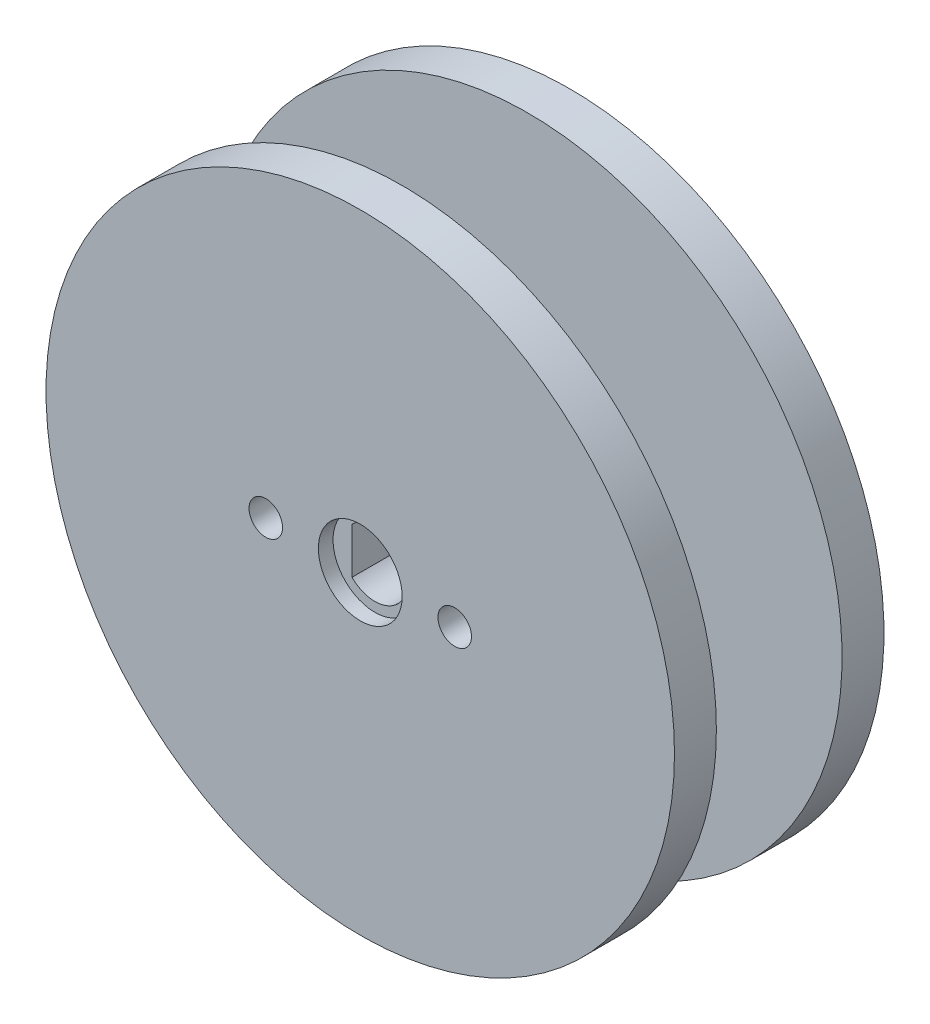
ISO-10303-21;
HEADER;
FILE_DESCRIPTION(('STEP AP214'),'2;1');
FILE_NAME('part.step','',(''),(''),'','','');
FILE_SCHEMA(('AUTOMOTIVE_DESIGN { 1 0 10303 214 1 1 1 1 }'));
ENDSEC;
DATA;
#1=APPLICATION_CONTEXT('core data for automotive mechanical design processes');
#2=APPLICATION_PROTOCOL_DEFINITION('international standard','automotive_design',2000,#1);
#3=PRODUCT_CONTEXT('',#1,'mechanical');
#4=PRODUCT('Part','Part','',(#3));
#5=PRODUCT_RELATED_PRODUCT_CATEGORY('part','',(#4));
#6=PRODUCT_DEFINITION_FORMATION('','',#4);
#7=PRODUCT_DEFINITION_CONTEXT('part definition',#1,'design');
#8=PRODUCT_DEFINITION('design','',#6,#7);
#9=PRODUCT_DEFINITION_SHAPE('','',#8);
#10=(LENGTH_UNIT() NAMED_UNIT(*) SI_UNIT(.MILLI.,.METRE.));
#11=(NAMED_UNIT(*) PLANE_ANGLE_UNIT() SI_UNIT($,.RADIAN.));
#12=(NAMED_UNIT(*) SI_UNIT($,.STERADIAN.) SOLID_ANGLE_UNIT());
#13=UNCERTAINTY_MEASURE_WITH_UNIT(LENGTH_MEASURE(1.E-05),#10,'distance_accuracy_value','');
#14=(GEOMETRIC_REPRESENTATION_CONTEXT(3) GLOBAL_UNCERTAINTY_ASSIGNED_CONTEXT((#13)) GLOBAL_UNIT_ASSIGNED_CONTEXT((#10,
#11,#12)) REPRESENTATION_CONTEXT('',''));
#15=CARTESIAN_POINT('',(0.,0.,0.));
#16=DIRECTION('',(0.,0.,1.));
#17=DIRECTION('',(1.,0.,0.));
#18=AXIS2_PLACEMENT_3D('',#15,#16,#17);
#19=CARTESIAN_POINT('',(0.,0.,8.));
#20=DIRECTION('',(0.,0.,-1.));
#21=DIRECTION('',(-1.,0.,0.));
#22=AXIS2_PLACEMENT_3D('',#19,#20,#21);
#23=CYLINDRICAL_SURFACE('',#22,1.55);
#24=CARTESIAN_POINT('',(0.,0.,7.3));
#25=DIRECTION('',(0.,0.,1.));
#26=DIRECTION('',(1.,0.,0.));
#27=AXIS2_PLACEMENT_3D('',#24,#25,#26);
#28=CIRCLE('',#27,1.55);
#29=CARTESIAN_POINT('',(-1.09533333333333,1.09669726401085,7.3));
#30=VERTEX_POINT('',#29);
#31=CARTESIAN_POINT('',(-1.09533333333333,-1.09669726401085,7.3));
#32=VERTEX_POINT('',#31);
#33=EDGE_CURVE('E52',#30,#32,#28,.F.);
#34=ORIENTED_EDGE('',*,*,#33,.F.);
#35=DIRECTION('',(0.,0.,-1.));
#36=VECTOR('',#35,1.);
#37=CARTESIAN_POINT('',(-1.09533333333333,1.09669726401085,8.));
#38=LINE('',#37,#36);
#39=CARTESIAN_POINT('',(-1.09533333333333,1.09669726401085,-2.));
#40=VERTEX_POINT('',#39);
#41=EDGE_CURVE('E68',#30,#40,#38,.T.);
#42=ORIENTED_EDGE('',*,*,#41,.T.);
#43=CARTESIAN_POINT('',(0.,0.,-2.));
#44=DIRECTION('',(0.,0.,-1.));
#45=DIRECTION('',(-1.,0.,0.));
#46=AXIS2_PLACEMENT_3D('',#43,#44,#45);
#47=CIRCLE('',#46,1.55);
#48=CARTESIAN_POINT('',(-1.09533333333333,-1.09669726401085,-2.));
#49=VERTEX_POINT('',#48);
#50=EDGE_CURVE('E69',#40,#49,#47,.T.);
#51=ORIENTED_EDGE('',*,*,#50,.T.);
#52=DIRECTION('',(0.,0.,-1.));
#53=VECTOR('',#52,1.);
#54=CARTESIAN_POINT('',(-1.09533333333333,-1.09669726401085,8.));
#55=LINE('',#54,#53);
#56=EDGE_CURVE('E59',#32,#49,#55,.T.);
#57=ORIENTED_EDGE('',*,*,#56,.F.);
#58=EDGE_LOOP('',(#34,#42,#51,#57));
#59=FACE_BOUND('',#58,.T.);
#60=ADVANCED_FACE('F38',(#59),#23,.F.);
#61=CARTESIAN_POINT('',(-1.09533333333333,1.09669726401085,8.));
#62=DIRECTION('',(-1.,0.,0.));
#63=DIRECTION('',(0.,0.,1.));
#64=AXIS2_PLACEMENT_3D('',#61,#62,#63);
#65=PLANE('',#64);
#66=DIRECTION('',(0.,1.,0.));
#67=VECTOR('',#66,1.);
#68=CARTESIAN_POINT('',(-1.09533333333333,1.09669726401085,7.3));
#69=LINE('',#68,#67);
#70=EDGE_CURVE('E11',#32,#30,#69,.T.);
#71=ORIENTED_EDGE('',*,*,#70,.F.);
#72=ORIENTED_EDGE('',*,*,#56,.T.);
#73=DIRECTION('',(0.,1.,0.));
#74=VECTOR('',#73,1.);
#75=CARTESIAN_POINT('',(-1.09533333333333,1.09669726401085,-2.));
#76=LINE('',#75,#74);
#77=EDGE_CURVE('E74',#49,#40,#76,.T.);
#78=ORIENTED_EDGE('',*,*,#77,.T.);
#79=ORIENTED_EDGE('',*,*,#41,.F.);
#80=EDGE_LOOP('',(#71,#72,#78,#79));
#81=FACE_BOUND('',#80,.T.);
#82=ADVANCED_FACE('F72',(#81),#65,.F.);
#83=CARTESIAN_POINT('',(0.,0.,3.));
#84=DIRECTION('',(0.,0.,1.));
#85=DIRECTION('',(1.,0.,0.));
#86=AXIS2_PLACEMENT_3D('',#83,#84,#85);
#87=TOROIDAL_SURFACE('',#86,5.5,3.);
#88=CARTESIAN_POINT('',(3.84590634261577,-0.447005305401507,5.51971305273532));
#89=CARTESIAN_POINT('',(3.8736657957954,-0.488206800975002,5.54060192491901));
#90=CARTESIAN_POINT('',(3.90493997473341,-0.526352777900137,5.56298081347047));
#91=CARTESIAN_POINT('',(3.97361066421637,-0.596126887451473,5.60876043869469));
#92=CARTESIAN_POINT('',(4.01102750979954,-0.627732555291743,5.63216437337878));
#93=CARTESIAN_POINT('',(4.09114575943373,-0.683716747534394,5.6784516763839));
#94=CARTESIAN_POINT('',(4.13384019268729,-0.708104663772777,5.7013356851022));
#95=CARTESIAN_POINT('',(4.22364112865989,-0.748855362876252,5.74543973880093));
#96=CARTESIAN_POINT('',(4.27074222054837,-0.765227837589809,5.76666176713467));
#97=CARTESIAN_POINT('',(4.36735794436639,-0.788835080549227,5.80624577416201));
#98=CARTESIAN_POINT('',(4.41681749335596,-0.796221398309971,5.82465047462435));
#99=CARTESIAN_POINT('',(4.5172666641873,-0.801537289848154,5.85844466005841));
#100=CARTESIAN_POINT('',(4.5682555443175,-0.799471376486522,5.87383558026599));
#101=CARTESIAN_POINT('',(4.66469282239618,-0.786133156007755,5.89998092206338));
#102=CARTESIAN_POINT('',(4.7101879542234,-0.775796797946422,5.91104421286877));
#103=CARTESIAN_POINT('',(4.79916882584744,-0.747127520136588,5.93057884861724));
#104=CARTESIAN_POINT('',(4.84265532276102,-0.728797641049508,5.93905117705565));
#105=CARTESIAN_POINT('',(4.92348175134706,-0.685914554423775,5.95321014804157));
#106=CARTESIAN_POINT('',(4.96103451357555,-0.661806246675306,5.95903458385347));
#107=CARTESIAN_POINT('',(5.03174506827459,-0.607545338842571,5.96893431921367));
#108=CARTESIAN_POINT('',(5.06490325034442,-0.577393275160692,5.97300977388881));
#109=CARTESIAN_POINT('',(5.12545589320538,-0.512247345021257,5.97973524598194));
#110=CARTESIAN_POINT('',(5.15290818354631,-0.477308688041868,5.98240003680366));
#111=CARTESIAN_POINT('',(5.20167895474551,-0.403328247570261,5.9867118679521));
#112=CARTESIAN_POINT('',(5.22299724570435,-0.364286337098531,5.98835887677162));
#113=CARTESIAN_POINT('',(5.25900348307997,-0.282921492316378,5.99093528820772));
#114=CARTESIAN_POINT('',(5.27364619188831,-0.240578384652845,5.99185982418838));
#115=CARTESIAN_POINT('',(5.29567106874993,-0.154036101922157,5.99318832147928));
#116=CARTESIAN_POINT('',(5.30305302883622,-0.109836873728622,5.99359226787857));
#117=CARTESIAN_POINT('',(5.31036401942534,-0.0206080905449987,5.99399261612088));
#118=CARTESIAN_POINT('',(5.31025677885737,0.0244244492216642,5.99398703456575));
#119=CARTESIAN_POINT('',(5.30250182704995,0.113834042614353,5.99356177554952));
#120=CARTESIAN_POINT('',(5.294854009545,0.158211086993873,5.99314209225269));
#121=CARTESIAN_POINT('',(5.2722273647608,0.245087076993612,5.99177088723134));
#122=CARTESIAN_POINT('',(5.25724239408749,0.287584416168563,5.99081891973058));
#123=CARTESIAN_POINT('',(5.22037314074514,0.369448300672347,5.98816032004576));
#124=CARTESIAN_POINT('',(5.19848890417183,0.408814866916457,5.98645369290376));
#125=CARTESIAN_POINT('',(5.14852822322437,0.48319904717897,5.98198513651752));
#126=CARTESIAN_POINT('',(5.12046653098194,0.518226716468673,5.97922571010121));
#127=CARTESIAN_POINT('',(5.05897451706233,0.583036597984468,5.97229781042599));
#128=CARTESIAN_POINT('',(5.02554456741038,0.612819173400795,5.96812943478646));
#129=CARTESIAN_POINT('',(4.95460803053221,0.666122724410597,5.95805967229898));
#130=CARTESIAN_POINT('',(4.91713059986848,0.689684759038145,5.9521702190737));
#131=CARTESIAN_POINT('',(4.83911468194933,0.730206406578141,5.93834593502795));
#132=CARTESIAN_POINT('',(4.7985764747645,0.747166622705471,5.93041129118881));
#133=CARTESIAN_POINT('',(4.71585044593173,0.774115016239555,5.91232256270147));
#134=CARTESIAN_POINT('',(4.67366741578304,0.784122049144866,5.90217457923738));
#135=CARTESIAN_POINT('',(4.58884671101613,0.797198859420019,5.87959664166633));
#136=CARTESIAN_POINT('',(4.54620899570448,0.800268010537971,5.86716648166688));
#137=CARTESIAN_POINT('',(4.46058352480771,0.799687740500946,5.83978902872421));
#138=CARTESIAN_POINT('',(4.41761546797994,0.79586164754522,5.82478471645772));
#139=CARTESIAN_POINT('',(4.33356389362078,0.781607688319427,5.79279991739771));
#140=CARTESIAN_POINT('',(4.29248078349526,0.771178401999713,5.77581900616799));
#141=CARTESIAN_POINT('',(4.21012159194872,0.743287873175992,5.7390272230306));
#142=CARTESIAN_POINT('',(4.16905428461722,0.725365169122906,5.71910002670496));
#143=CARTESIAN_POINT('',(4.09082097306606,0.683222492861921,5.67821319994903));
#144=CARTESIAN_POINT('',(4.05365866798119,0.658996623949805,5.65725261773307));
#145=CARTESIAN_POINT('',(3.98046132356736,0.602167743110023,5.61318209891638));
#146=CARTESIAN_POINT('',(3.94488572932509,0.568979895461213,5.59006099431035));
#147=CARTESIAN_POINT('',(3.87993465202862,0.496171698215627,5.54523782055409));
#148=CARTESIAN_POINT('',(3.8505555591567,0.4565551176601,5.52353493032727));
#149=CARTESIAN_POINT('',(3.80517305169282,0.381497815482867,5.48841855774988));
#150=CARTESIAN_POINT('',(3.78765103914619,0.347322576068484,5.47426367876685));
#151=CARTESIAN_POINT('',(3.75742243243851,0.275812293621728,5.44918265271952));
#152=CARTESIAN_POINT('',(3.74470727187317,0.238483018174353,5.43825076960768));
#153=CARTESIAN_POINT('',(3.72633804884,0.167310601356769,5.4222090585503));
#154=CARTESIAN_POINT('',(3.71989778932614,0.133816765135987,5.41646162870088));
#155=CARTESIAN_POINT('',(3.71135328133478,0.0658535142941662,5.40880173737713));
#156=CARTESIAN_POINT('',(3.70924565825473,0.0313848801542608,5.40688629127968));
#157=CARTESIAN_POINT('',(3.70950958886731,-0.0375513562851095,5.40712496494974));
#158=CARTESIAN_POINT('',(3.71188530138707,-0.0720189279383176,5.40928286322924));
#159=CARTESIAN_POINT('',(3.72095900498777,-0.139934323434069,5.41740820443054));
#160=CARTESIAN_POINT('',(3.72766130563741,-0.173381095666829,5.42337944563115));
#161=CARTESIAN_POINT('',(3.74501955081187,-0.238554264204807,5.43850589277525));
#162=CARTESIAN_POINT('',(3.75568679713242,-0.270275442627187,5.44767019559324));
#163=CARTESIAN_POINT('',(3.78051049916783,-0.331436411570226,5.46838927771473));
#164=CARTESIAN_POINT('',(3.79466386903667,-0.360878189639608,5.47994194144422));
#165=CARTESIAN_POINT('',(3.82145226665705,-0.409008611633465,5.50107398233102));
#166=CARTESIAN_POINT('',(3.83331790889555,-0.428321137062714,5.51024030911631));
#167=CARTESIAN_POINT('',(3.84590634261577,-0.447005305401507,5.51971305273532));
#168=B_SPLINE_CURVE_WITH_KNOTS('',3,(#88,#89,#90,#91,#92,#93,#94,#95,#96,#97,#98,#99,#100,#101,
#102,#103,#104,#105,#106,#107,#108,#109,#110,#111,#112,#113,#114,#115,#116,#117,#118,#119,#120,
#121,#122,#123,#124,#125,#126,#127,#128,#129,#130,#131,#132,#133,#134,#135,#136,#137,#138,#139,
#140,#141,#142,#143,#144,#145,#146,#147,#148,#149,#150,#151,#152,#153,#154,#155,#156,#157,#158,
#159,#160,#161,#162,#163,#164,#165,#166,#167),.UNSPECIFIED.,.T.,.F.,(4,2,2,2,2,2,2,2,2,2,2,2,2,
2,2,2,2,2,2,2,2,2,2,2,2,2,2,2,2,2,2,2,2,2,2,2,2,2,2,4),(0.,0.161600596043769,0.323747370555806,
0.485682220371078,0.647420780524826,0.806392061163768,0.96528745068355,1.10838167364714,
1.25142151230716,1.3857854787599,1.52013752526328,1.6530532272666,1.78597304369845,
1.91978068057509,2.05359214994371,2.18805172857219,2.32251320209768,2.45708745316039,
2.59166080511783,2.72591620837891,2.86016231162732,2.99349881195332,3.12682312632603,
3.25978446850146,3.39275781202972,3.52918680326382,3.6656451442028,3.81215686473554,
3.95880614509003,4.1196881468866,4.28047616522288,4.40282959756593,4.52496394138022,
4.62827635933461,4.73150827880897,4.83483600524232,4.93826681208395,5.04199473068361,
5.14563115933597,5.21891424525564),.UNSPECIFIED.);
#169=CARTESIAN_POINT('',(3.84590634261577,-0.447005305401507,5.51971305273532));
#170=VERTEX_POINT('',#169);
#171=EDGE_CURVE('E325',#170,#170,#168,.T.);
#172=ORIENTED_EDGE('',*,*,#171,.T.);
#173=EDGE_LOOP('',(#172));
#174=FACE_BOUND('',#173,.T.);
#175=CARTESIAN_POINT('',(-5.06228618167669,-0.578174330453134,5.9725635555975));
#176=CARTESIAN_POINT('',(-5.03030500488935,-0.608752404973662,5.96870893865694));
#177=CARTESIAN_POINT('',(-4.99579362410612,-0.636659657368072,5.96410535080206));
#178=CARTESIAN_POINT('',(-4.92278200037975,-0.686330111290471,5.95305605506126));
#179=CARTESIAN_POINT('',(-4.88427333513377,-0.708079964683237,5.94660640515561));
#180=CARTESIAN_POINT('',(-4.80459349550698,-0.744825588460931,5.93159618420919));
#181=CARTESIAN_POINT('',(-4.7634255121407,-0.759829287751273,5.92303810966462));
#182=CARTESIAN_POINT('',(-4.67972684535911,-0.78285571133062,5.90365311765589));
#183=CARTESIAN_POINT('',(-4.63719683475282,-0.790881828867673,5.8928273061907));
#184=CARTESIAN_POINT('',(-4.55163462060293,-0.800051926965312,5.86878560900146));
#185=CARTESIAN_POINT('',(-4.50860151586213,-0.801129092851337,5.85554777426391));
#186=CARTESIAN_POINT('',(-4.42363076209671,-0.796530393154323,5.82692390376569));
#187=CARTESIAN_POINT('',(-4.38169341922979,-0.790852660431337,5.81153727508884));
#188=CARTESIAN_POINT('',(-4.29759489325126,-0.772725253678213,5.7780298084748));
#189=CARTESIAN_POINT('',(-4.25555472311551,-0.759911381130719,5.75980365303739));
#190=CARTESIAN_POINT('',(-4.17467428365921,-0.727922901849148,5.72188509079244));
#191=CARTESIAN_POINT('',(-4.13583582963184,-0.708744717255481,5.70219186407392));
#192=CARTESIAN_POINT('',(-4.05846086925881,-0.662497430798277,5.66012383826044));
#193=CARTESIAN_POINT('',(-4.02031307505196,-0.63484657822345,5.63767335540682));
#194=CARTESIAN_POINT('',(-3.94932099486244,-0.573197167237218,5.59303905268779));
#195=CARTESIAN_POINT('',(-3.91647859629708,-0.539196359036044,5.57085533030986));
#196=CARTESIAN_POINT('',(-3.86048492434741,-0.469771547302976,5.53090361827071));
#197=CARTESIAN_POINT('',(-3.83664008763688,-0.435027661015909,5.51292713480073));
#198=CARTESIAN_POINT('',(-3.79430265281812,-0.361219439878678,5.47975689479346));
#199=CARTESIAN_POINT('',(-3.77580154359225,-0.322162113896519,5.46455872748172));
#200=CARTESIAN_POINT('',(-3.74826308210462,-0.248818722116708,5.44133470198051));
#201=CARTESIAN_POINT('',(-3.73805617652488,-0.215240026643889,5.43247380896978));
#202=CARTESIAN_POINT('',(-3.7220713461152,-0.146307570385357,5.41842462207925));
#203=CARTESIAN_POINT('',(-3.71628843248698,-0.110955857074749,5.41323219189494));
#204=CARTESIAN_POINT('',(-3.70951973345738,-0.03923559456745,5.40714193328157));
#205=CARTESIAN_POINT('',(-3.70855787783206,-0.00286287243102346,5.40626552822484));
#206=CARTESIAN_POINT('',(-3.71157407329029,0.0695078185921197,5.40899017211841));
#207=CARTESIAN_POINT('',(-3.71555312756685,0.105505709877265,5.41259213034732));
#208=CARTESIAN_POINT('',(-3.72771058883791,0.173545757594184,5.42339741122221));
#209=CARTESIAN_POINT('',(-3.73557741786207,0.205688847444054,5.43033260640786));
#210=CARTESIAN_POINT('',(-3.75492521281088,0.268104632378489,5.44698981948681));
#211=CARTESIAN_POINT('',(-3.7664088059629,0.298375948618029,5.45671386274658));
#212=CARTESIAN_POINT('',(-3.79828092777594,0.369397538980454,5.4829102341097));
#213=CARTESIAN_POINT('',(-3.82037038373876,0.408981922926679,5.50047844954565));
#214=CARTESIAN_POINT('',(-3.87018671674688,0.483162273240104,5.53800232042236));
#215=CARTESIAN_POINT('',(-3.89792266927207,0.517750053723196,5.55796179775715));
#216=CARTESIAN_POINT('',(-3.95880171855604,0.582119156957181,5.59912809598338));
#217=CARTESIAN_POINT('',(-3.99202040929109,0.611819669650258,5.62034923885603));
#218=CARTESIAN_POINT('',(-4.06297608479665,0.665361590007413,5.6625960004649));
#219=CARTESIAN_POINT('',(-4.10071220980098,0.689204109946879,5.6836216555884));
#220=CARTESIAN_POINT('',(-4.18471177870381,0.732860887846886,5.72694017260616));
#221=CARTESIAN_POINT('',(-4.2314567330724,0.751892555377657,5.74909918750791));
#222=CARTESIAN_POINT('',(-4.32868916830052,0.780976770951903,5.7910277710986));
#223=CARTESIAN_POINT('',(-4.37917572079463,0.791031538319655,5.81079792932966));
#224=CARTESIAN_POINT('',(-4.47867971311452,0.800862907958791,5.84597366643121));
#225=CARTESIAN_POINT('',(-4.52755742184901,0.801302017175522,5.8615864932043));
#226=CARTESIAN_POINT('',(-4.62540727709802,0.793058243187125,5.88981293636591));
#227=CARTESIAN_POINT('',(-4.67437934044746,0.784381354175199,5.90242851689928));
#228=CARTESIAN_POINT('',(-4.76599096593649,0.759073140680511,5.92361940285686));
#229=CARTESIAN_POINT('',(-4.80879563858762,0.743257494786835,5.93246149554266));
#230=CARTESIAN_POINT('',(-4.89141048848561,0.704364176847662,5.94786621045081));
#231=CARTESIAN_POINT('',(-4.9312213378526,0.681288140843013,5.95442934550841));
#232=CARTESIAN_POINT('',(-5.0049888188098,0.629535198682406,5.96537701298052));
#233=CARTESIAN_POINT('',(-5.03911387866926,0.601113626034073,5.96983693324609));
#234=CARTESIAN_POINT('',(-5.10226855888959,0.538922124256695,5.97729576815299));
#235=CARTESIAN_POINT('',(-5.1312983241045,0.505152347223582,5.98029472433234));
#236=CARTESIAN_POINT('',(-5.18336843682701,0.4332412542951,5.98518022629812));
#237=CARTESIAN_POINT('',(-5.20641291226416,0.395102977562005,5.98706753990624));
#238=CARTESIAN_POINT('',(-5.24586888170413,0.315507725717116,5.99004324232946));
#239=CARTESIAN_POINT('',(-5.26228006251573,0.274050594016169,5.99113159342349));
#240=CARTESIAN_POINT('',(-5.28809169350862,0.188674562583849,5.99275110810765));
#241=CARTESIAN_POINT('',(-5.29744134272203,0.144740223120218,5.99327824519047));
#242=CARTESIAN_POINT('',(-5.3086685270725,0.0559276075666258,5.99390325303014));
#243=CARTESIAN_POINT('',(-5.31054656575625,0.0110493952935946,5.99400115271535));
#244=CARTESIAN_POINT('',(-5.30677352707496,-0.0785213302615419,5.99379644947503));
#245=CARTESIAN_POINT('',(-5.30110024152008,-0.123212906316586,5.99349266522794));
#246=CARTESIAN_POINT('',(-5.28234131243765,-0.211031878645072,5.9923946826854));
#247=CARTESIAN_POINT('',(-5.26925189169272,-0.25415846591237,5.99160023446431));
#248=CARTESIAN_POINT('',(-5.23603197924498,-0.337616259646348,5.98932419687911));
#249=CARTESIAN_POINT('',(-5.21589688162421,-0.37794561678557,5.98784215781431));
#250=CARTESIAN_POINT('',(-5.16920871202613,-0.454553204881142,5.98390503877159));
#251=CARTESIAN_POINT('',(-5.1426704970646,-0.490840533649168,5.98145220299632));
#252=CARTESIAN_POINT('',(-5.09716124277091,-0.543247096914741,5.97662894434535));
#253=CARTESIAN_POINT('',(-5.08011697040832,-0.561125827509628,5.97471265913943));
#254=CARTESIAN_POINT('',(-5.06228618167669,-0.578174330453134,5.9725635555975));
#255=B_SPLINE_CURVE_WITH_KNOTS('',3,(#175,#176,#177,#178,#179,#180,#181,#182,#183,#184,#185,
#186,#187,#188,#189,#190,#191,#192,#193,#194,#195,#196,#197,#198,#199,#200,#201,#202,#203,#204,
#205,#206,#207,#208,#209,#210,#211,#212,#213,#214,#215,#216,#217,#218,#219,#220,#221,#222,#223,
#224,#225,#226,#227,#228,#229,#230,#231,#232,#233,#234,#235,#236,#237,#238,#239,#240,#241,#242,
#243,#244,#245,#246,#247,#248,#249,#250,#251,#252,#253,#254),.UNSPECIFIED.,.T.,.F.,(4,2,2,2,2,2,
2,2,2,2,2,2,2,2,2,2,2,2,2,2,2,2,2,2,2,2,2,2,2,2,2,2,2,2,2,2,2,2,2,4),(0.,0.133168340433744,
0.266623193156662,0.399920780761347,0.53315350847354,0.667665392931658,0.802214466826629,
0.94435916750027,1.08658391418243,1.2424950096937,1.39846144967461,1.53539325514699,
1.67210574707841,1.78026307597088,1.88829825868298,1.99686915683437,2.10546210262069,
2.2064963432202,2.30760414530058,2.45266926267769,2.59796940715935,2.74547217778162,
2.89294691991066,3.05744356364359,3.22189952823769,3.37498612110245,3.5279721153699,
3.66671650824189,3.80542965911242,3.93869926802492,4.07196508760455,4.20513875099304,
4.33831870144606,4.47244786031644,4.60656797944388,4.74108341414206,4.87566742247964,
5.01033957629456,5.14470220838103,5.21894889917062),.UNSPECIFIED.);
#256=CARTESIAN_POINT('',(-5.06228618167669,-0.578174330453134,5.9725635555975));
#257=VERTEX_POINT('',#256);
#258=EDGE_CURVE('E317',#257,#257,#255,.T.);
#259=ORIENTED_EDGE('',*,*,#258,.T.);
#260=EDGE_LOOP('',(#259));
#261=FACE_BOUND('',#260,.T.);
#262=CARTESIAN_POINT('',(0.,0.,6.));
#263=DIRECTION('',(0.,0.,1.));
#264=DIRECTION('',(1.,0.,0.));
#265=AXIS2_PLACEMENT_3D('',#262,#263,#264);
#266=CIRCLE('',#265,5.5);
#267=CARTESIAN_POINT('',(5.5,0.,6.));
#268=VERTEX_POINT('',#267);
#269=EDGE_CURVE('E47',#268,#268,#266,.T.);
#270=ORIENTED_EDGE('',*,*,#269,.F.);
#271=EDGE_LOOP('',(#270));
#272=FACE_BOUND('',#271,.T.);
#273=CARTESIAN_POINT('',(0.,0.,3.));
#274=DIRECTION('',(0.,0.,-1.));
#275=DIRECTION('',(-1.,0.,0.));
#276=AXIS2_PLACEMENT_3D('',#273,#274,#275);
#277=CIRCLE('',#276,2.5);
#278=CARTESIAN_POINT('',(-2.5,0.,3.));
#279=VERTEX_POINT('',#278);
#280=EDGE_CURVE('E96',#279,#279,#277,.F.);
#281=ORIENTED_EDGE('',*,*,#280,.T.);
#282=EDGE_LOOP('',(#281));
#283=FACE_BOUND('',#282,.T.);
#284=ADVANCED_FACE('F40',(#174,#261,#272,#283),#87,.F.);
#285=CARTESIAN_POINT('',(0.,0.,3.));
#286=DIRECTION('',(0.,0.,-1.));
#287=DIRECTION('',(-1.,0.,0.));
#288=AXIS2_PLACEMENT_3D('',#285,#286,#287);
#289=TOROIDAL_SURFACE('',#288,5.5,3.);
#290=CARTESIAN_POINT('',(3.94347854916072,-0.574703338429461,0.410562509084625));
#291=CARTESIAN_POINT('',(3.91225995542862,-0.544472656016675,0.431187960716097));
#292=CARTESIAN_POINT('',(3.88336542822972,-0.51157048351105,0.451524480443944));
#293=CARTESIAN_POINT('',(3.8308629197222,-0.440685398459626,0.49030869344545));
#294=CARTESIAN_POINT('',(3.80726234713788,-0.402695482980632,0.508753720291332));
#295=CARTESIAN_POINT('',(3.7702580081881,-0.329854636242655,0.538751674430651));
#296=CARTESIAN_POINT('',(3.75576399168275,-0.295827913092118,0.550947393373104));
#297=CARTESIAN_POINT('',(3.73143220128674,-0.225156399254574,0.571853258450303));
#298=CARTESIAN_POINT('',(3.72158666586419,-0.188516091069967,0.580569210938419));
#299=CARTESIAN_POINT('',(3.70709105601842,-0.113057060702028,0.593529409428109));
#300=CARTESIAN_POINT('',(3.70248929027287,-0.0742214888234717,0.597732056187733));
#301=CARTESIAN_POINT('',(3.69905627259236,0.00391206374141341,0.600858894000825));
#302=CARTESIAN_POINT('',(3.700221832824,0.0432097770018653,0.599786001059647));
#303=CARTESIAN_POINT('',(3.70764897657696,0.115383618912574,0.593053728440472));
#304=CARTESIAN_POINT('',(3.71318968999787,0.148401252028683,0.588043590256017));
#305=CARTESIAN_POINT('',(3.72813224641645,0.212877997513369,0.574796395910108));
#306=CARTESIAN_POINT('',(3.73753711725434,0.244335865984907,0.566556809481608));
#307=CARTESIAN_POINT('',(3.76368775286218,0.315844260792248,0.544242930295654));
#308=CARTESIAN_POINT('',(3.78185052635402,0.355052291643808,0.529135858562867));
#309=CARTESIAN_POINT('',(3.82352297717714,0.4291778740206,0.496060715381896));
#310=CARTESIAN_POINT('',(3.84704066841093,0.464088872943561,0.478088368116828));
#311=CARTESIAN_POINT('',(3.89919432914607,0.529930146868,0.440344978638897));
#312=CARTESIAN_POINT('',(3.92791335732515,0.560779228951453,0.420547775394379));
#313=CARTESIAN_POINT('',(3.98964840191873,0.617493852940879,0.380557074822039));
#314=CARTESIAN_POINT('',(4.02266431179278,0.643359518370388,0.360363587330556));
#315=CARTESIAN_POINT('',(4.09876168215896,0.693862441963175,0.316905163030894));
#316=CARTESIAN_POINT('',(4.14258952631543,0.717466450703135,0.293731374062163));
#317=CARTESIAN_POINT('',(4.23467008688104,0.756370179473028,0.24920308070513));
#318=CARTESIAN_POINT('',(4.28292322180422,0.771669113116467,0.227848748757934));
#319=CARTESIAN_POINT('',(4.38084162660782,0.79260356956294,0.188520937133106));
#320=CARTESIAN_POINT('',(4.43040324246009,0.798549706952465,0.170457251320884));
#321=CARTESIAN_POINT('',(4.53076082586743,0.800978904840752,0.137387698270428));
#322=CARTESIAN_POINT('',(4.58155580154156,0.797469335233563,0.122379459387516));
#323=CARTESIAN_POINT('',(4.67728660907127,0.781462747431246,0.096964034307413));
#324=CARTESIAN_POINT('',(4.72229811804983,0.769904693476354,0.0862459838303254));
#325=CARTESIAN_POINT('',(4.81009328347068,0.738922465998344,0.067355730671245));
#326=CARTESIAN_POINT('',(4.85287763696622,0.719500770540381,0.0591827274039543));
#327=CARTESIAN_POINT('',(4.93230700377301,0.67459107874007,0.0455196782719038));
#328=CARTESIAN_POINT('',(4.96916320900561,0.649513654262217,0.0399029006691566));
#329=CARTESIAN_POINT('',(5.03832311155903,0.593455095938031,0.0303717190924351));
#330=CARTESIAN_POINT('',(5.07062717834895,0.562474441701196,0.026457176904626));
#331=CARTESIAN_POINT('',(5.12941333078405,0.495780215761658,0.0200007769257338));
#332=CARTESIAN_POINT('',(5.15594410318169,0.460110647612266,0.017447153835409));
#333=CARTESIAN_POINT('',(5.20275807876514,0.384832179317079,0.0133251814692399));
#334=CARTESIAN_POINT('',(5.22304108655849,0.345223156020079,0.0117568630061984));
#335=CARTESIAN_POINT('',(5.25688744923852,0.262898228712274,0.0093175173555134));
#336=CARTESIAN_POINT('',(5.27040460699741,0.220163189092228,0.00845125964157679));
#337=CARTESIAN_POINT('',(5.29012553602912,0.133030345268001,0.00723414754339626));
#338=CARTESIAN_POINT('',(5.29632910339278,0.088632494738831,0.00688330752937301));
#339=CARTESIAN_POINT('',(5.30125708889643,-0.000778083497315261,0.00660217442308021));
#340=CARTESIAN_POINT('',(5.29994786057352,-0.0457926752139408,0.00667377328659273));
#341=CARTESIAN_POINT('',(5.28980900073611,-0.134964404647243,0.00726209052854403));
#342=CARTESIAN_POINT('',(5.28097926964039,-0.179121531002047,0.00777881480102203));
#343=CARTESIAN_POINT('',(5.25604522601997,-0.265350853295568,0.00939223723832161));
#344=CARTESIAN_POINT('',(5.23993645623124,-0.307421754206965,0.0104892908337476));
#345=CARTESIAN_POINT('',(5.20091199506729,-0.388247520948008,0.0135001017907787));
#346=CARTESIAN_POINT('',(5.17799637910636,-0.427002423510071,0.0154138501041784));
#347=CARTESIAN_POINT('',(5.12611150077436,-0.499983365604599,0.0203662572675685));
#348=CARTESIAN_POINT('',(5.09715889185193,-0.534221449494086,0.0234018388961364));
#349=CARTESIAN_POINT('',(5.03404895824657,-0.597312376750642,0.0309536586550355));
#350=CARTESIAN_POINT('',(4.99989203757007,-0.626165637750588,0.0354697818834534));
#351=CARTESIAN_POINT('',(4.92770430434353,-0.677508064325604,0.0462963198368398));
#352=CARTESIAN_POINT('',(4.8897018965182,-0.700039835254411,0.0525941181480756));
#353=CARTESIAN_POINT('',(4.81084770910484,-0.738442090282963,0.0672820744152829));
#354=CARTESIAN_POINT('',(4.76999609717839,-0.754312965958431,0.0756721093281757));
#355=CARTESIAN_POINT('',(4.68679063803108,-0.779096920486026,0.0947092184553406));
#356=CARTESIAN_POINT('',(4.64443832153082,-0.788016887178338,0.105354044995768));
#357=CARTESIAN_POINT('',(4.55949120559662,-0.798933883399153,0.128925302920725));
#358=CARTESIAN_POINT('',(4.51689641327698,-0.800931115004469,0.14185166769486));
#359=CARTESIAN_POINT('',(4.43137561727295,-0.798232992314749,0.170260379869442));
#360=CARTESIAN_POINT('',(4.38847790121586,-0.793335404248345,0.185807683785447));
#361=CARTESIAN_POINT('',(4.30470966578588,-0.776972251929369,0.218845184454472));
#362=CARTESIAN_POINT('',(4.263840998442,-0.765500802893223,0.236337110669858));
#363=CARTESIAN_POINT('',(4.18185176015962,-0.735417192451836,0.27421475381084));
#364=CARTESIAN_POINT('',(4.140969118699,-0.716310140115535,0.294719967489061));
#365=CARTESIAN_POINT('',(4.06337259492001,-0.671828145167246,0.336604923476145));
#366=CARTESIAN_POINT('',(4.02665132275682,-0.646464575876305,0.35798302082438));
#367=CARTESIAN_POINT('',(3.9754493843241,-0.604418908050405,0.38975500409104));
#368=CARTESIAN_POINT('',(3.95917037825072,-0.589898600130425,0.400195256008385));
#369=CARTESIAN_POINT('',(3.94347854916072,-0.574703338429461,0.410562509084625));
#370=B_SPLINE_CURVE_WITH_KNOTS('',3,(#290,#291,#292,#293,#294,#295,#296,#297,#298,#299,#300,
#301,#302,#303,#304,#305,#306,#307,#308,#309,#310,#311,#312,#313,#314,#315,#316,#317,#318,#319,
#320,#321,#322,#323,#324,#325,#326,#327,#328,#329,#330,#331,#332,#333,#334,#335,#336,#337,#338,
#339,#340,#341,#342,#343,#344,#345,#346,#347,#348,#349,#350,#351,#352,#353,#354,#355,#356,#357,
#358,#359,#360,#361,#362,#363,#364,#365,#366,#367,#368,#369),.UNSPECIFIED.,.T.,.F.,(4,2,2,2,2,2,
2,2,2,2,2,2,2,2,2,2,2,2,2,2,2,2,2,2,2,2,2,2,2,2,2,2,2,2,2,2,2,2,2,4),(0.,0.14425289020259,
0.288706415519653,0.405093878070622,0.521286316089243,0.638540745902947,0.755730371712369,
0.856846873938304,0.958042759648695,1.09462958120144,1.23142217113804,1.37063066106662,
1.50983570000183,1.67375333712072,1.83768649247884,1.99605078358543,2.1542916793345,
2.29662482455267,2.43891315126919,2.57306198871659,2.70719993184896,2.84015861142045,
2.97312144871694,3.10698017525393,3.24084263379883,3.3753050691563,3.50976928499862,
3.64431595079555,3.7788611259813,3.91303994649314,4.04720835611555,4.18044950137684,
4.31368281265989,4.4467839310358,4.57988116411549,4.71696464568662,4.85417103365839,
5.00227776195463,5.15011721538612,5.22262502013292),.UNSPECIFIED.);
#371=CARTESIAN_POINT('',(3.94347854916072,-0.574703338429461,0.410562509084625));
#372=VERTEX_POINT('',#371);
#373=EDGE_CURVE('E302',#372,#372,#370,.T.);
#374=ORIENTED_EDGE('',*,*,#373,.T.);
#375=EDGE_LOOP('',(#374));
#376=FACE_BOUND('',#375,.T.);
#377=CARTESIAN_POINT('',(-5.15063792422485,-0.465478600144171,0.0180254821498235));
#378=CARTESIAN_POINT('',(-5.17661095314734,-0.429168591465967,0.0155365401830941));
#379=CARTESIAN_POINT('',(-5.19959755210817,-0.390590007843195,0.0136081573107561));
#380=CARTESIAN_POINT('',(-5.23884645041213,-0.310037490157125,0.0105670995982095));
#381=CARTESIAN_POINT('',(-5.25509048824304,-0.268054698588199,0.00945663378843215));
#382=CARTESIAN_POINT('',(-5.28031080752674,-0.181992930262537,0.00781960884563681));
#383=CARTESIAN_POINT('',(-5.28929555570312,-0.137916459167933,0.00729236921291409));
#384=CARTESIAN_POINT('',(-5.29975961970459,-0.0489087246615653,0.00668423573738491));
#385=CARTESIAN_POINT('',(-5.30124353737339,-0.00397800233242646,0.00660306822166076));
#386=CARTESIAN_POINT('',(-5.29667338634525,0.085596095299989,0.00686355818523155));
#387=CARTESIAN_POINT('',(-5.29060294529231,0.130238634978384,0.0072061340222272));
#388=CARTESIAN_POINT('',(-5.27106831854525,0.217874656562953,0.00840893718423968));
#389=CARTESIAN_POINT('',(-5.2576031855106,0.260867926424543,0.00926923083589733));
#390=CARTESIAN_POINT('',(-5.22367478129537,0.343958978900997,0.0117080466095921));
#391=CARTESIAN_POINT('',(-5.20321408772602,0.38405782142609,0.0132863042585412));
#392=CARTESIAN_POINT('',(-5.15589693397301,0.460227219728951,0.0174500470236057));
#393=CARTESIAN_POINT('',(-5.12904074747404,0.496297947786304,0.0200354890419191));
#394=CARTESIAN_POINT('',(-5.06986990523822,0.563236517107837,0.0265466745403597));
#395=CARTESIAN_POINT('',(-5.03757832771581,0.594125297218951,0.0304668201015528));
#396=CARTESIAN_POINT('',(-4.96846753135575,0.650009634980798,0.0400064614371014));
#397=CARTESIAN_POINT('',(-4.93164873892034,0.675005746995004,0.0456257972434159));
#398=CARTESIAN_POINT('',(-4.85493470961,0.718294857377663,0.058836037341635));
#399=CARTESIAN_POINT('',(-4.81506286983733,0.736633655066679,0.0664128322786239));
#400=CARTESIAN_POINT('',(-4.73329722791647,0.766463548461369,0.0837755688537048));
#401=CARTESIAN_POINT('',(-4.69140351512063,0.777954946474242,0.0935614129377449));
#402=CARTESIAN_POINT('',(-4.60665652188129,0.794037508715706,0.115486150274527));
#403=CARTESIAN_POINT('',(-4.56379911611563,0.798588720749527,0.127638216851549));
#404=CARTESIAN_POINT('',(-4.47860523654291,0.800849265453604,0.154173451734231));
#405=CARTESIAN_POINT('',(-4.43626886657878,0.79855725574595,0.168557057257654));
#406=CARTESIAN_POINT('',(-4.35132263762362,0.787282027213948,0.19999628992488));
#407=CARTESIAN_POINT('',(-4.30878639099783,0.778002000407049,0.21714310446139));
#408=CARTESIAN_POINT('',(-4.22642738022751,0.753002167792006,0.253137016647606));
#409=CARTESIAN_POINT('',(-4.1866052381732,0.737280891359048,0.271984501816754));
#410=CARTESIAN_POINT('',(-4.10693098566587,0.698310902653651,0.312533543344442));
#411=CARTESIAN_POINT('',(-4.06740206508468,0.674509882580011,0.33433904702209));
#412=CARTESIAN_POINT('',(-3.99305431051292,0.620579993546078,0.378301255160345));
#413=CARTESIAN_POINT('',(-3.95824266404092,0.590441643029442,0.400458439338236));
#414=CARTESIAN_POINT('',(-3.89139218835267,0.521617047564627,0.445618319046538));
#415=CARTESIAN_POINT('',(-3.859807334152,0.482435735525881,0.468543808686894));
#416=CARTESIAN_POINT('',(-3.80397529797469,0.397634263039056,0.511179300535448));
#417=CARTESIAN_POINT('',(-3.77971066779667,0.352029799694663,0.530896896383168));
#418=CARTESIAN_POINT('',(-3.74665917178871,0.271448209901975,0.558674901795567));
#419=CARTESIAN_POINT('',(-3.73541167939566,0.238061285239756,0.568425093288424));
#420=CARTESIAN_POINT('',(-3.71731643710534,0.169307994824268,0.584342034427459));
#421=CARTESIAN_POINT('',(-3.71046215822765,0.133944651767614,0.590514100399906));
#422=CARTESIAN_POINT('',(-3.70156784442275,0.0618902747192189,0.598558101589461));
#423=CARTESIAN_POINT('',(-3.6995578575404,0.0251923799863667,0.600403195688363));
#424=CARTESIAN_POINT('',(-3.700605744885,-0.0480725236729556,0.599447580824311));
#425=CARTESIAN_POINT('',(-3.70366403725444,-0.0846395215507541,0.596646488542312));
#426=CARTESIAN_POINT('',(-3.71413573192129,-0.153375961638461,0.587216551636579));
#427=CARTESIAN_POINT('',(-3.72115832661503,-0.185655545814537,0.580932003502675));
#428=CARTESIAN_POINT('',(-3.73885930331288,-0.24845769089764,0.565438768014779));
#429=CARTESIAN_POINT('',(-3.74954039186397,-0.278978931401197,0.556227916153297));
#430=CARTESIAN_POINT('',(-3.77924657603685,-0.350073342230406,0.531327951975846));
#431=CARTESIAN_POINT('',(-3.79989555603292,-0.38958173458438,0.514535170880832));
#432=CARTESIAN_POINT('',(-3.8467224997605,-0.463856800037243,0.4783694839654));
#433=CARTESIAN_POINT('',(-3.87290934147553,-0.498615709955643,0.458992453872069));
#434=CARTESIAN_POINT('',(-3.9306018648533,-0.563653098397082,0.418763722230763));
#435=CARTESIAN_POINT('',(-3.96218885400521,-0.593847331153364,0.397892837587743));
#436=CARTESIAN_POINT('',(-4.02981110957937,-0.648704851667107,0.356123181113312));
#437=CARTESIAN_POINT('',(-4.06584581852599,-0.673368831495231,0.335224413100947));
#438=CARTESIAN_POINT('',(-4.14716070996873,-0.719713375157816,0.291431958000207));
#439=CARTESIAN_POINT('',(-4.19302924395185,-0.740495996990184,0.268667370679213));
#440=CARTESIAN_POINT('',(-4.28880430708077,-0.773275298424689,0.225348112637831));
#441=CARTESIAN_POINT('',(-4.33871035325295,-0.785273027169067,0.204793178278269));
#442=CARTESIAN_POINT('',(-4.4380297741444,-0.799076753313653,0.167795166314285));
#443=CARTESIAN_POINT('',(-4.48730151864948,-0.801437349385791,0.151181997744723));
#444=CARTESIAN_POINT('',(-4.58633700307799,-0.79686718275271,0.121007007863943));
#445=CARTESIAN_POINT('',(-4.63610029591722,-0.789944207639913,0.107442640183795));
#446=CARTESIAN_POINT('',(-4.72933612900432,-0.767772030685172,0.084607967016375));
#447=CARTESIAN_POINT('',(-4.77294832303344,-0.75340223547322,0.0750476325309095));
#448=CARTESIAN_POINT('',(-4.8574659650407,-0.717168342188994,0.0583049997695579));
#449=CARTESIAN_POINT('',(-4.89837040874947,-0.695301481927571,0.0511235798917591));
#450=CARTESIAN_POINT('',(-4.97422954176829,-0.645807522899253,0.0391218934960308));
#451=CARTESIAN_POINT('',(-5.0093693522058,-0.618484644691126,0.0342097557049247));
#452=CARTESIAN_POINT('',(-5.07465896263482,-0.558325727329918,0.0259517416008766));
#453=CARTESIAN_POINT('',(-5.10482187803848,-0.525504653294612,0.0226017047288051));
#454=CARTESIAN_POINT('',(-5.13839611654804,-0.482244033573731,0.0192134281033316));
#455=CARTESIAN_POINT('',(-5.14459777592966,-0.473922661007092,0.0186042971437168));
#456=CARTESIAN_POINT('',(-5.15063792422485,-0.465478600144171,0.0180254821498235));
#457=B_SPLINE_CURVE_WITH_KNOTS('',3,(#377,#378,#379,#380,#381,#382,#383,#384,#385,#386,#387,
#388,#389,#390,#391,#392,#393,#394,#395,#396,#397,#398,#399,#400,#401,#402,#403,#404,#405,#406,
#407,#408,#409,#410,#411,#412,#413,#414,#415,#416,#417,#418,#419,#420,#421,#422,#423,#424,#425,
#426,#427,#428,#429,#430,#431,#432,#433,#434,#435,#436,#437,#438,#439,#440,#441,#442,#443,#444,
#445,#446,#447,#448,#449,#450,#451,#452,#453,#454,#455,#456),.UNSPECIFIED.,.T.,.F.,(4,2,2,2,2,2,
2,2,2,2,2,2,2,2,2,2,2,2,2,2,2,2,2,2,2,2,2,2,2,2,2,2,2,2,2,2,2,2,2,4),(0.,0.134111423299182,
0.268583739751546,0.402898989847882,0.537131826020587,0.671656088682688,0.806197589388864,
0.940689569744359,1.07517579576893,1.20910477896261,1.34302115751097,1.47599796419622,
1.60896889962712,1.74270244983345,1.87646223516183,2.01624832479327,2.15606634728883,
2.30853300501768,2.46122941882216,2.62631197867848,2.7909978874398,2.9002472562388,
3.00933388514713,3.11909543175482,3.22886603434533,3.32933930728673,3.42988707128931,
3.57202894178925,3.71440043729787,3.85914268669185,4.00386681253112,4.16880617749945,
4.33372584125003,4.48900818266722,4.64416034579373,4.78415650743149,4.92420430423193,
5.05793673524695,5.19131091451346,5.22249914778511),.UNSPECIFIED.);
#458=CARTESIAN_POINT('',(-5.15063792422485,-0.465478600144171,0.0180254821498235));
#459=VERTEX_POINT('',#458);
#460=EDGE_CURVE('E309',#459,#459,#457,.T.);
#461=ORIENTED_EDGE('',*,*,#460,.T.);
#462=EDGE_LOOP('',(#461));
#463=FACE_BOUND('',#462,.T.);
#464=CARTESIAN_POINT('',(0.,0.,0.));
#465=DIRECTION('',(0.,0.,-1.));
#466=DIRECTION('',(-1.,0.,0.));
#467=AXIS2_PLACEMENT_3D('',#464,#465,#466);
#468=CIRCLE('',#467,5.5);
#469=CARTESIAN_POINT('',(-5.5,0.,0.));
#470=VERTEX_POINT('',#469);
#471=EDGE_CURVE('E91',#470,#470,#468,.T.);
#472=ORIENTED_EDGE('',*,*,#471,.F.);
#473=EDGE_LOOP('',(#472));
#474=FACE_BOUND('',#473,.T.);
#475=ORIENTED_EDGE('',*,*,#280,.F.);
#476=EDGE_LOOP('',(#475));
#477=FACE_BOUND('',#476,.T.);
#478=ADVANCED_FACE('F106',(#376,#463,#474,#477),#289,.F.);
#479=CARTESIAN_POINT('',(0.,0.,-2.));
#480=DIRECTION('',(0.,0.,1.));
#481=DIRECTION('',(1.,0.,0.));
#482=AXIS2_PLACEMENT_3D('',#479,#480,#481);
#483=CYLINDRICAL_SURFACE('',#482,15.);
#484=CARTESIAN_POINT('',(0.,0.,-2.));
#485=DIRECTION('',(0.,0.,-1.));
#486=DIRECTION('',(-1.,0.,0.));
#487=AXIS2_PLACEMENT_3D('',#484,#485,#486);
#488=CIRCLE('',#487,15.);
#489=CARTESIAN_POINT('',(-15.,0.,-2.));
#490=VERTEX_POINT('',#489);
#491=EDGE_CURVE('E88',#490,#490,#488,.T.);
#492=ORIENTED_EDGE('',*,*,#491,.F.);
#493=EDGE_LOOP('',(#492));
#494=FACE_BOUND('',#493,.T.);
#495=CARTESIAN_POINT('',(0.,0.,0.));
#496=DIRECTION('',(0.,0.,-1.));
#497=DIRECTION('',(-1.,0.,0.));
#498=AXIS2_PLACEMENT_3D('',#495,#496,#497);
#499=CIRCLE('',#498,15.);
#500=CARTESIAN_POINT('',(-15.,0.,0.));
#501=VERTEX_POINT('',#500);
#502=EDGE_CURVE('E86',#501,#501,#499,.T.);
#503=ORIENTED_EDGE('',*,*,#502,.T.);
#504=EDGE_LOOP('',(#503));
#505=FACE_BOUND('',#504,.T.);
#506=ADVANCED_FACE('F111',(#494,#505),#483,.T.);
#507=CARTESIAN_POINT('',(0.,0.,-2.));
#508=DIRECTION('',(0.,0.,-1.));
#509=DIRECTION('',(-1.,0.,0.));
#510=AXIS2_PLACEMENT_3D('',#507,#508,#509);
#511=PLANE('',#510);
#512=CARTESIAN_POINT('',(4.5,0.,-2.));
#513=DIRECTION('',(0.,0.,-1.));
#514=DIRECTION('',(-1.,0.,0.));
#515=AXIS2_PLACEMENT_3D('',#512,#513,#514);
#516=CIRCLE('',#515,0.8);
#517=CARTESIAN_POINT('',(3.7,0.,-2.));
#518=VERTEX_POINT('',#517);
#519=EDGE_CURVE('E357',#518,#518,#516,.T.);
#520=ORIENTED_EDGE('',*,*,#519,.F.);
#521=EDGE_LOOP('',(#520));
#522=FACE_BOUND('',#521,.T.);
#523=CARTESIAN_POINT('',(-4.5,0.,-2.));
#524=DIRECTION('',(0.,0.,-1.));
#525=DIRECTION('',(-1.,0.,0.));
#526=AXIS2_PLACEMENT_3D('',#523,#524,#525);
#527=CIRCLE('',#526,0.800000000000001);
#528=CARTESIAN_POINT('',(-5.3,0.,-2.));
#529=VERTEX_POINT('',#528);
#530=EDGE_CURVE('E358',#529,#529,#527,.T.);
#531=ORIENTED_EDGE('',*,*,#530,.F.);
#532=EDGE_LOOP('',(#531));
#533=FACE_BOUND('',#532,.T.);
#534=ORIENTED_EDGE('',*,*,#50,.F.);
#535=ORIENTED_EDGE('',*,*,#77,.F.);
#536=EDGE_LOOP('',(#534,#535));
#537=FACE_BOUND('',#536,.T.);
#538=ORIENTED_EDGE('',*,*,#491,.T.);
#539=EDGE_LOOP('',(#538));
#540=FACE_BOUND('',#539,.T.);
#541=ADVANCED_FACE('F116',(#522,#533,#537,#540),#511,.T.);
#542=CARTESIAN_POINT('',(0.,0.,0.));
#543=DIRECTION('',(0.,0.,-1.));
#544=DIRECTION('',(-1.,0.,0.));
#545=AXIS2_PLACEMENT_3D('',#542,#543,#544);
#546=PLANE('',#545);
#547=ORIENTED_EDGE('',*,*,#471,.T.);
#548=EDGE_LOOP('',(#547));
#549=FACE_BOUND('',#548,.T.);
#550=ORIENTED_EDGE('',*,*,#502,.F.);
#551=EDGE_LOOP('',(#550));
#552=FACE_BOUND('',#551,.T.);
#553=ADVANCED_FACE('F139',(#549,#552),#546,.F.);
#554=CARTESIAN_POINT('',(0.,0.,8.));
#555=DIRECTION('',(0.,0.,-1.));
#556=DIRECTION('',(-1.,0.,0.));
#557=AXIS2_PLACEMENT_3D('',#554,#555,#556);
#558=CYLINDRICAL_SURFACE('',#557,15.);
#559=CARTESIAN_POINT('',(0.,0.,8.));
#560=DIRECTION('',(0.,0.,1.));
#561=DIRECTION('',(1.,0.,0.));
#562=AXIS2_PLACEMENT_3D('',#559,#560,#561);
#563=CIRCLE('',#562,15.);
#564=CARTESIAN_POINT('',(15.,0.,8.));
#565=VERTEX_POINT('',#564);
#566=EDGE_CURVE('E79',#565,#565,#563,.T.);
#567=ORIENTED_EDGE('',*,*,#566,.F.);
#568=EDGE_LOOP('',(#567));
#569=FACE_BOUND('',#568,.T.);
#570=CARTESIAN_POINT('',(0.,0.,6.));
#571=DIRECTION('',(0.,0.,1.));
#572=DIRECTION('',(1.,0.,0.));
#573=AXIS2_PLACEMENT_3D('',#570,#571,#572);
#574=CIRCLE('',#573,15.);
#575=CARTESIAN_POINT('',(15.,0.,6.));
#576=VERTEX_POINT('',#575);
#577=EDGE_CURVE('E76',#576,#576,#574,.T.);
#578=ORIENTED_EDGE('',*,*,#577,.T.);
#579=EDGE_LOOP('',(#578));
#580=FACE_BOUND('',#579,.T.);
#581=ADVANCED_FACE('F133',(#569,#580),#558,.T.);
#582=CARTESIAN_POINT('',(0.,0.,8.));
#583=DIRECTION('',(0.,0.,1.));
#584=DIRECTION('',(1.,0.,0.));
#585=AXIS2_PLACEMENT_3D('',#582,#583,#584);
#586=PLANE('',#585);
#587=CARTESIAN_POINT('',(4.50937168231308,0.,8.));
#588=DIRECTION('',(0.,0.,1.));
#589=DIRECTION('',(1.,0.,0.));
#590=AXIS2_PLACEMENT_3D('',#587,#588,#589);
#591=CIRCLE('',#590,0.8);
#592=CARTESIAN_POINT('',(5.30937168231309,0.,8.));
#593=VERTEX_POINT('',#592);
#594=EDGE_CURVE('E314',#593,#593,#591,.T.);
#595=ORIENTED_EDGE('',*,*,#594,.F.);
#596=EDGE_LOOP('',(#595));
#597=FACE_BOUND('',#596,.T.);
#598=CARTESIAN_POINT('',(-4.50937168231308,0.,8.));
#599=DIRECTION('',(0.,0.,1.));
#600=DIRECTION('',(1.,0.,0.));
#601=AXIS2_PLACEMENT_3D('',#598,#599,#600);
#602=CIRCLE('',#601,0.8);
#603=CARTESIAN_POINT('',(-3.70937168231309,0.,8.));
#604=VERTEX_POINT('',#603);
#605=EDGE_CURVE('E308',#604,#604,#602,.T.);
#606=ORIENTED_EDGE('',*,*,#605,.F.);
#607=EDGE_LOOP('',(#606));
#608=FACE_BOUND('',#607,.T.);
#609=CARTESIAN_POINT('',(0.,0.,8.));
#610=DIRECTION('',(0.,0.,1.));
#611=DIRECTION('',(1.,0.,0.));
#612=AXIS2_PLACEMENT_3D('',#609,#610,#611);
#613=CIRCLE('',#612,1.99937168231309);
#614=CARTESIAN_POINT('',(1.99937168231309,0.,8.));
#615=VERTEX_POINT('',#614);
#616=EDGE_CURVE('E333',#615,#615,#613,.T.);
#617=ORIENTED_EDGE('',*,*,#616,.F.);
#618=EDGE_LOOP('',(#617));
#619=FACE_BOUND('',#618,.T.);
#620=ORIENTED_EDGE('',*,*,#566,.T.);
#621=EDGE_LOOP('',(#620));
#622=FACE_BOUND('',#621,.T.);
#623=ADVANCED_FACE('F130',(#597,#608,#619,#622),#586,.T.);
#624=CARTESIAN_POINT('',(0.,0.,6.));
#625=DIRECTION('',(0.,0.,1.));
#626=DIRECTION('',(1.,0.,0.));
#627=AXIS2_PLACEMENT_3D('',#624,#625,#626);
#628=PLANE('',#627);
#629=ORIENTED_EDGE('',*,*,#269,.T.);
#630=EDGE_LOOP('',(#629));
#631=FACE_BOUND('',#630,.T.);
#632=ORIENTED_EDGE('',*,*,#577,.F.);
#633=EDGE_LOOP('',(#632));
#634=FACE_BOUND('',#633,.T.);
#635=ADVANCED_FACE('F101',(#631,#634),#628,.F.);
#636=CARTESIAN_POINT('',(0.,0.,7.3));
#637=DIRECTION('',(0.,0.,1.));
#638=DIRECTION('',(1.,0.,0.));
#639=AXIS2_PLACEMENT_3D('',#636,#637,#638);
#640=PLANE('',#639);
#641=CARTESIAN_POINT('',(0.,0.,7.3));
#642=DIRECTION('',(0.,0.,1.));
#643=DIRECTION('',(1.,0.,0.));
#644=AXIS2_PLACEMENT_3D('',#641,#642,#643);
#645=CIRCLE('',#644,1.99937168231309);
#646=CARTESIAN_POINT('',(1.99937168231309,0.,7.3));
#647=VERTEX_POINT('',#646);
#648=EDGE_CURVE('E70',#647,#647,#645,.T.);
#649=ORIENTED_EDGE('',*,*,#648,.T.);
#650=EDGE_LOOP('',(#649));
#651=FACE_BOUND('',#650,.T.);
#652=ORIENTED_EDGE('',*,*,#33,.T.);
#653=ORIENTED_EDGE('',*,*,#70,.T.);
#654=EDGE_LOOP('',(#652,#653));
#655=FACE_BOUND('',#654,.T.);
#656=ADVANCED_FACE('F65',(#651,#655),#640,.T.);
#657=CARTESIAN_POINT('',(0.,0.,7.3));
#658=DIRECTION('',(0.,0.,1.));
#659=DIRECTION('',(1.,0.,0.));
#660=AXIS2_PLACEMENT_3D('',#657,#658,#659);
#661=CYLINDRICAL_SURFACE('',#660,1.99937168231309);
#662=ORIENTED_EDGE('',*,*,#648,.F.);
#663=EDGE_LOOP('',(#662));
#664=FACE_BOUND('',#663,.T.);
#665=ORIENTED_EDGE('',*,*,#616,.T.);
#666=EDGE_LOOP('',(#665));
#667=FACE_BOUND('',#666,.T.);
#668=ADVANCED_FACE('F176',(#664,#667),#661,.F.);
#669=CARTESIAN_POINT('',(-4.50937168231308,0.,5.));
#670=DIRECTION('',(0.,0.,1.));
#671=DIRECTION('',(1.,0.,0.));
#672=AXIS2_PLACEMENT_3D('',#669,#670,#671);
#673=CYLINDRICAL_SURFACE('',#672,0.8);
#674=ORIENTED_EDGE('',*,*,#605,.T.);
#675=EDGE_LOOP('',(#674));
#676=FACE_BOUND('',#675,.T.);
#677=ORIENTED_EDGE('',*,*,#258,.F.);
#678=EDGE_LOOP('',(#677));
#679=FACE_BOUND('',#678,.T.);
#680=ADVANCED_FACE('F185',(#676,#679),#673,.F.);
#681=CARTESIAN_POINT('',(4.50937168231308,0.,5.));
#682=DIRECTION('',(0.,0.,1.));
#683=DIRECTION('',(1.,0.,0.));
#684=AXIS2_PLACEMENT_3D('',#681,#682,#683);
#685=CYLINDRICAL_SURFACE('',#684,0.8);
#686=ORIENTED_EDGE('',*,*,#594,.T.);
#687=EDGE_LOOP('',(#686));
#688=FACE_BOUND('',#687,.T.);
#689=ORIENTED_EDGE('',*,*,#171,.F.);
#690=EDGE_LOOP('',(#689));
#691=FACE_BOUND('',#690,.T.);
#692=ADVANCED_FACE('F191',(#688,#691),#685,.F.);
#693=CARTESIAN_POINT('',(-4.5,0.,3.));
#694=DIRECTION('',(0.,0.,-1.));
#695=DIRECTION('',(-1.,0.,0.));
#696=AXIS2_PLACEMENT_3D('',#693,#694,#695);
#697=CYLINDRICAL_SURFACE('',#696,0.800000000000001);
#698=ORIENTED_EDGE('',*,*,#530,.T.);
#699=EDGE_LOOP('',(#698));
#700=FACE_BOUND('',#699,.T.);
#701=ORIENTED_EDGE('',*,*,#460,.F.);
#702=EDGE_LOOP('',(#701));
#703=FACE_BOUND('',#702,.T.);
#704=ADVANCED_FACE('F199',(#700,#703),#697,.F.);
#705=CARTESIAN_POINT('',(4.5,0.,3.));
#706=DIRECTION('',(0.,0.,-1.));
#707=DIRECTION('',(-1.,0.,0.));
#708=AXIS2_PLACEMENT_3D('',#705,#706,#707);
#709=CYLINDRICAL_SURFACE('',#708,0.8);
#710=ORIENTED_EDGE('',*,*,#519,.T.);
#711=EDGE_LOOP('',(#710));
#712=FACE_BOUND('',#711,.T.);
#713=ORIENTED_EDGE('',*,*,#373,.F.);
#714=EDGE_LOOP('',(#713));
#715=FACE_BOUND('',#714,.T.);
#716=ADVANCED_FACE('F207',(#712,#715),#709,.F.);
#717=CLOSED_SHELL('',(#60,#82,#284,#478,#506,#541,#553,#581,#623,#635,#656,#668,#680,#692,#704,#716));
#718=MANIFOLD_SOLID_BREP('B2',#717);
#719=ADVANCED_BREP_SHAPE_REPRESENTATION('',(#18,#718),#14);
#720=SHAPE_DEFINITION_REPRESENTATION(#9,#719);
ENDSEC;
END-ISO-10303-21;
